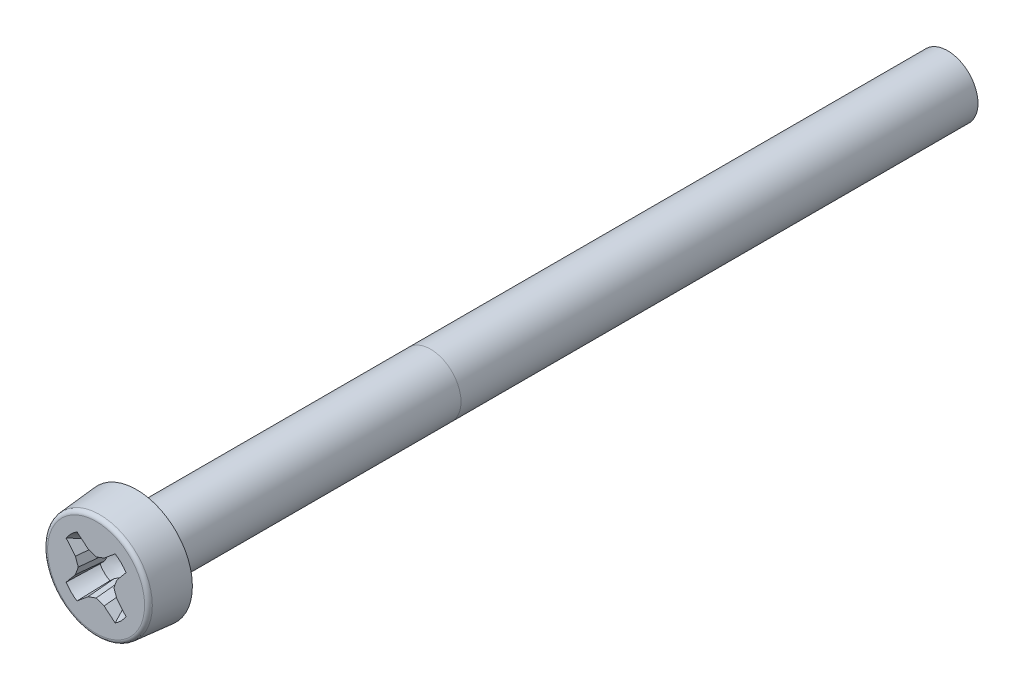
ISO-10303-21;
HEADER;
FILE_DESCRIPTION(('STEP AP214'),'2;1');
FILE_NAME('part.step','',(''),(''),'','','');
FILE_SCHEMA(('AUTOMOTIVE_DESIGN { 1 0 10303 214 1 1 1 1 }'));
ENDSEC;
DATA;
#1=APPLICATION_CONTEXT('core data for automotive mechanical design processes');
#2=APPLICATION_PROTOCOL_DEFINITION('international standard','automotive_design',2000,#1);
#3=PRODUCT_CONTEXT('',#1,'mechanical');
#4=PRODUCT('Part','Part','',(#3));
#5=PRODUCT_RELATED_PRODUCT_CATEGORY('part','',(#4));
#6=PRODUCT_DEFINITION_FORMATION('','',#4);
#7=PRODUCT_DEFINITION_CONTEXT('part definition',#1,'design');
#8=PRODUCT_DEFINITION('design','',#6,#7);
#9=PRODUCT_DEFINITION_SHAPE('','',#8);
#10=(LENGTH_UNIT() NAMED_UNIT(*) SI_UNIT(.MILLI.,.METRE.));
#11=(NAMED_UNIT(*) PLANE_ANGLE_UNIT() SI_UNIT($,.RADIAN.));
#12=(NAMED_UNIT(*) SI_UNIT($,.STERADIAN.) SOLID_ANGLE_UNIT());
#13=UNCERTAINTY_MEASURE_WITH_UNIT(LENGTH_MEASURE(1.E-05),#10,'distance_accuracy_value','');
#14=(GEOMETRIC_REPRESENTATION_CONTEXT(3) GLOBAL_UNCERTAINTY_ASSIGNED_CONTEXT((#13)) GLOBAL_UNIT_ASSIGNED_CONTEXT((#10,
#11,#12)) REPRESENTATION_CONTEXT('',''));
#15=CARTESIAN_POINT('',(0.,0.,0.));
#16=DIRECTION('',(0.,0.,1.));
#17=DIRECTION('',(1.,0.,0.));
#18=AXIS2_PLACEMENT_3D('',#15,#16,#17);
#19=CARTESIAN_POINT('',(0.,0.,-40.));
#20=DIRECTION('',(0.,0.,1.));
#21=DIRECTION('',(1.,0.,0.));
#22=AXIS2_PLACEMENT_3D('',#19,#20,#21);
#23=PLANE('',#22);
#24=CARTESIAN_POINT('',(0.,0.,-40.));
#25=DIRECTION('',(0.,0.,1.));
#26=DIRECTION('',(1.,0.,0.));
#27=AXIS2_PLACEMENT_3D('',#24,#25,#26);
#28=CIRCLE('',#27,1.5);
#29=CARTESIAN_POINT('',(1.5,0.,-40.));
#30=VERTEX_POINT('',#29);
#31=EDGE_CURVE('E11',#30,#30,#28,.T.);
#32=ORIENTED_EDGE('',*,*,#31,.F.);
#33=EDGE_LOOP('',(#32));
#34=FACE_BOUND('',#33,.T.);
#35=ADVANCED_FACE('F16',(#34),#23,.F.);
#36=CARTESIAN_POINT('',(0.,0.,-14.5));
#37=DIRECTION('',(0.,0.,-1.));
#38=DIRECTION('',(1.,0.,0.));
#39=AXIS2_PLACEMENT_3D('',#36,#37,#38);
#40=CYLINDRICAL_SURFACE('',#39,1.5);
#41=DIRECTION('',(0.,0.,-1.));
#42=VECTOR('',#41,1.);
#43=CARTESIAN_POINT('',(1.5,0.,-14.5));
#44=LINE('',#43,#42);
#45=CARTESIAN_POINT('',(1.5,0.,-14.5));
#46=VERTEX_POINT('',#45);
#47=EDGE_CURVE('E29',#46,#30,#44,.T.);
#48=ORIENTED_EDGE('',*,*,#47,.T.);
#49=ORIENTED_EDGE('',*,*,#31,.T.);
#50=ORIENTED_EDGE('',*,*,#47,.F.);
#51=CARTESIAN_POINT('',(0.,0.,-14.5));
#52=DIRECTION('',(0.,0.,1.));
#53=DIRECTION('',(1.,0.,0.));
#54=AXIS2_PLACEMENT_3D('',#51,#52,#53);
#55=CIRCLE('',#54,1.5);
#56=EDGE_CURVE('E341',#46,#46,#55,.T.);
#57=ORIENTED_EDGE('',*,*,#56,.F.);
#58=EDGE_LOOP('',(#48,#49,#50,#57));
#59=FACE_BOUND('',#58,.T.);
#60=ADVANCED_FACE('F628',(#59),#40,.T.);
#61=CARTESIAN_POINT('',(0.,0.,-0.1));
#62=DIRECTION('',(0.,0.,-1.));
#63=DIRECTION('',(1.,0.,0.));
#64=AXIS2_PLACEMENT_3D('',#61,#62,#63);
#65=CYLINDRICAL_SURFACE('',#64,1.5);
#66=DIRECTION('',(0.,0.,-1.));
#67=VECTOR('',#66,1.);
#68=CARTESIAN_POINT('',(1.5,0.,-0.1));
#69=LINE('',#68,#67);
#70=CARTESIAN_POINT('',(1.5,0.,-0.1));
#71=VERTEX_POINT('',#70);
#72=EDGE_CURVE('E334',#71,#46,#69,.T.);
#73=ORIENTED_EDGE('',*,*,#72,.T.);
#74=ORIENTED_EDGE('',*,*,#56,.T.);
#75=ORIENTED_EDGE('',*,*,#72,.F.);
#76=CARTESIAN_POINT('',(0.,0.,-0.1));
#77=DIRECTION('',(0.,0.,1.));
#78=DIRECTION('',(1.,0.,0.));
#79=AXIS2_PLACEMENT_3D('',#76,#77,#78);
#80=CIRCLE('',#79,1.5);
#81=EDGE_CURVE('E342',#71,#71,#80,.T.);
#82=ORIENTED_EDGE('',*,*,#81,.F.);
#83=EDGE_LOOP('',(#73,#74,#75,#82));
#84=FACE_BOUND('',#83,.T.);
#85=ADVANCED_FACE('F593',(#84),#65,.T.);
#86=CARTESIAN_POINT('',(1.6,0.,0.));
#87=CARTESIAN_POINT('',(1.54142135623731,0.,0.));
#88=CARTESIAN_POINT('',(1.5,0.,-0.0414213562373095));
#89=CARTESIAN_POINT('',(1.5,0.,-0.1));
#90=(BOUNDED_CURVE() B_SPLINE_CURVE(3,(#86,#87,#88,#89),.UNSPECIFIED.,.F.,
.F.) B_SPLINE_CURVE_WITH_KNOTS((4,4),(0.,1.),
.UNSPECIFIED.) CURVE() GEOMETRIC_REPRESENTATION_ITEM() RATIONAL_B_SPLINE_CURVE((1.,
0.804737854124365,0.804737854124365,1.)) REPRESENTATION_ITEM(''));
#91=CARTESIAN_POINT('',(0.,0.,0.));
#92=DIRECTION('',(0.,0.,-1.));
#93=AXIS1_PLACEMENT('',#91,#92);
#94=SURFACE_OF_REVOLUTION('',#90,#93);
#95=CARTESIAN_POINT('',(1.6,0.,-0.1));
#96=DIRECTION('',(0.,-1.,0.));
#97=DIRECTION('',(0.,0.,1.));
#98=AXIS2_PLACEMENT_3D('',#95,#96,#97);
#99=CIRCLE('',#98,0.1);
#100=CARTESIAN_POINT('',(1.6,0.,0.));
#101=VERTEX_POINT('',#100);
#102=EDGE_CURVE('E419',#101,#71,#99,.T.);
#103=ORIENTED_EDGE('',*,*,#102,.T.);
#104=ORIENTED_EDGE('',*,*,#81,.T.);
#105=ORIENTED_EDGE('',*,*,#102,.F.);
#106=CARTESIAN_POINT('',(0.,0.,0.));
#107=DIRECTION('',(0.,0.,1.));
#108=DIRECTION('',(1.,0.,0.));
#109=AXIS2_PLACEMENT_3D('',#106,#107,#108);
#110=CIRCLE('',#109,1.6);
#111=EDGE_CURVE('E510',#101,#101,#110,.T.);
#112=ORIENTED_EDGE('',*,*,#111,.F.);
#113=EDGE_LOOP('',(#103,#104,#105,#112));
#114=FACE_BOUND('',#113,.T.);
#115=ADVANCED_FACE('F589',(#114),#94,.T.);
#116=CARTESIAN_POINT('',(0.,0.,0.));
#117=DIRECTION('',(0.,0.,1.));
#118=DIRECTION('',(1.,0.,0.));
#119=AXIS2_PLACEMENT_3D('',#116,#117,#118);
#120=PLANE('',#119);
#121=ORIENTED_EDGE('',*,*,#111,.T.);
#122=EDGE_LOOP('',(#121));
#123=FACE_BOUND('',#122,.T.);
#124=CARTESIAN_POINT('',(0.,0.,0.));
#125=DIRECTION('',(0.,0.,1.));
#126=DIRECTION('',(1.,0.,0.));
#127=AXIS2_PLACEMENT_3D('',#124,#125,#126);
#128=CIRCLE('',#127,2.75);
#129=CARTESIAN_POINT('',(2.75,0.,0.));
#130=VERTEX_POINT('',#129);
#131=EDGE_CURVE('E285',#130,#130,#128,.T.);
#132=ORIENTED_EDGE('',*,*,#131,.F.);
#133=EDGE_LOOP('',(#132));
#134=FACE_BOUND('',#133,.T.);
#135=ADVANCED_FACE('F592',(#123,#134),#120,.F.);
#136=CARTESIAN_POINT('',(0.,0.,1.81743114855));
#137=DIRECTION('',(0.,0.,-1.));
#138=DIRECTION('',(1.,0.,0.));
#139=AXIS2_PLACEMENT_3D('',#136,#137,#138);
#140=CONICAL_SURFACE('',#139,2.591759345272,0.08684928479054);
#141=DIRECTION('',(0.0867401448538781,0.,-0.996230970844978));
#142=VECTOR('',#141,1.);
#143=CARTESIAN_POINT('',(2.591759345272,0.,1.81743114855));
#144=LINE('',#143,#142);
#145=CARTESIAN_POINT('',(2.591759345272,0.,1.81743114855));
#146=VERTEX_POINT('',#145);
#147=EDGE_CURVE('E281',#146,#130,#144,.T.);
#148=ORIENTED_EDGE('',*,*,#147,.T.);
#149=ORIENTED_EDGE('',*,*,#131,.T.);
#150=ORIENTED_EDGE('',*,*,#147,.F.);
#151=CARTESIAN_POINT('',(0.,0.,1.81743114855));
#152=DIRECTION('',(0.,0.,1.));
#153=DIRECTION('',(1.,0.,0.));
#154=AXIS2_PLACEMENT_3D('',#151,#152,#153);
#155=CIRCLE('',#154,2.591759345272);
#156=EDGE_CURVE('E286',#146,#146,#155,.T.);
#157=ORIENTED_EDGE('',*,*,#156,.F.);
#158=EDGE_LOOP('',(#148,#149,#150,#157));
#159=FACE_BOUND('',#158,.T.);
#160=ADVANCED_FACE('F601',(#159),#140,.T.);
#161=CARTESIAN_POINT('',(2.392520405653,0.,2.));
#162=CARTESIAN_POINT('',(2.50172635124258,0.,2.));
#163=CARTESIAN_POINT('',(2.58224141997077,0.,1.92622153254636));
#164=CARTESIAN_POINT('',(2.59175934527131,0.,1.81743114854994));
#165=(BOUNDED_CURVE() B_SPLINE_CURVE(3,(#161,#162,#163,#164),.UNSPECIFIED.,.F.,
.F.) B_SPLINE_CURVE_WITH_KNOTS((4,4),(0.,1.),
.UNSPECIFIED.) CURVE() GEOMETRIC_REPRESENTATION_ITEM() RATIONAL_B_SPLINE_CURVE((1.,
0.824851557873878,0.824851557873878,1.)) REPRESENTATION_ITEM(''));
#166=CARTESIAN_POINT('',(0.,0.,0.));
#167=DIRECTION('',(0.,0.,-1.));
#168=AXIS1_PLACEMENT('',#166,#167);
#169=SURFACE_OF_REVOLUTION('',#165,#168);
#170=CARTESIAN_POINT('',(2.392520405653,0.,1.8));
#171=DIRECTION('',(0.,1.,0.));
#172=DIRECTION('',(0.,0.,1.));
#173=AXIS2_PLACEMENT_3D('',#170,#171,#172);
#174=CIRCLE('',#173,0.2);
#175=CARTESIAN_POINT('',(2.392520405653,0.,2.));
#176=VERTEX_POINT('',#175);
#177=EDGE_CURVE('E421',#176,#146,#174,.T.);
#178=ORIENTED_EDGE('',*,*,#177,.T.);
#179=ORIENTED_EDGE('',*,*,#156,.T.);
#180=ORIENTED_EDGE('',*,*,#177,.F.);
#181=CARTESIAN_POINT('',(0.,0.,2.));
#182=DIRECTION('',(0.,0.,1.));
#183=DIRECTION('',(1.,0.,0.));
#184=AXIS2_PLACEMENT_3D('',#181,#182,#183);
#185=CIRCLE('',#184,2.392520405653);
#186=EDGE_CURVE('E400',#176,#176,#185,.T.);
#187=ORIENTED_EDGE('',*,*,#186,.F.);
#188=EDGE_LOOP('',(#178,#179,#180,#187));
#189=FACE_BOUND('',#188,.T.);
#190=ADVANCED_FACE('F18',(#189),#169,.T.);
#191=CARTESIAN_POINT('',(0.947023607927,0.1975,1.963875213625));
#192=DIRECTION('',(-0.936058801009871,0.338983327629953,0.094256165002017));
#193=DIRECTION('',(0.100188061612041,0.,0.994968518250915));
#194=AXIS2_PLACEMENT_3D('',#191,#192,#193);
#195=PLANE('',#194);
#196=CARTESIAN_POINT('',(0.734999999999596,-9.30616694816422E-13,0.56855685952255));
#197=CARTESIAN_POINT('',(0.79980153318715,0.169360524085245,0.603012445904495));
#198=CARTESIAN_POINT('',(0.890868365166978,0.394999999999386,0.695907050353568));
#199=(BOUNDED_CURVE() B_SPLINE_CURVE(2,(#196,#197,#198),.UNSPECIFIED.,.F.,
.F.) B_SPLINE_CURVE_WITH_KNOTS((3,3),(0.,1.),
.UNSPECIFIED.) CURVE() GEOMETRIC_REPRESENTATION_ITEM() RATIONAL_B_SPLINE_CURVE((1.,
1.03521369543437,1.)) REPRESENTATION_ITEM(''));
#200=CARTESIAN_POINT('',(0.735,0.,0.568556859522));
#201=VERTEX_POINT('',#200);
#202=CARTESIAN_POINT('',(0.890868365168,0.395,0.695907050353));
#203=VERTEX_POINT('',#202);
#204=EDGE_CURVE('E372',#201,#203,#199,.T.);
#205=ORIENTED_EDGE('',*,*,#204,.F.);
#206=DIRECTION('',(-0.100188061611992,0.,-0.99496851825092));
#207=VECTOR('',#206,1.);
#208=CARTESIAN_POINT('',(1.055354479088,0.,3.75));
#209=LINE('',#208,#207);
#210=CARTESIAN_POINT('',(0.879138745017,0.,2.));
#211=VERTEX_POINT('',#210);
#212=EDGE_CURVE('E414',#211,#201,#209,.T.);
#213=ORIENTED_EDGE('',*,*,#212,.F.);
#214=DIRECTION('',(0.340499237923964,0.940244792047901,0.));
#215=VECTOR('',#214,1.);
#216=CARTESIAN_POINT('',(0.863725539296,-0.04256158250679,2.));
#217=LINE('',#216,#215);
#218=CARTESIAN_POINT('',(1.022183620264,0.395,2.));
#219=VERTEX_POINT('',#218);
#220=EDGE_CURVE('E458',#211,#219,#217,.T.);
#221=ORIENTED_EDGE('',*,*,#220,.T.);
#222=DIRECTION('',(-0.100188061611992,0.,-0.99496851825092));
#223=VECTOR('',#222,1.);
#224=CARTESIAN_POINT('',(1.198399354335,0.395,3.75));
#225=LINE('',#224,#223);
#226=EDGE_CURVE('E425',#219,#203,#225,.T.);
#227=ORIENTED_EDGE('',*,*,#226,.T.);
#228=EDGE_LOOP('',(#205,#213,#221,#227));
#229=FACE_BOUND('',#228,.T.);
#230=ADVANCED_FACE('F621',(#229),#195,.T.);
#231=CARTESIAN_POINT('',(2.231021642134,1.854404484376,1.963875213625));
#232=DIRECTION('',(-0.766881371683238,0.637126278968198,0.077220893632314));
#233=DIRECTION('',(0.100188061612077,0.,0.994968518250911));
#234=AXIS2_PLACEMENT_3D('',#231,#232,#233);
#235=PLANE('',#234);
#236=ORIENTED_EDGE('',*,*,#226,.F.);
#237=DIRECTION('',(0.63903443020369,0.769178130873627,0.));
#238=VECTOR('',#237,1.);
#239=CARTESIAN_POINT('',(1.321889247435,0.755742713105,2.));
#240=LINE('',#239,#238);
#241=CARTESIAN_POINT('',(1.475615257504,0.940776068904,2.));
#242=VERTEX_POINT('',#241);
#243=EDGE_CURVE('E462',#219,#242,#240,.T.);
#244=ORIENTED_EDGE('',*,*,#243,.T.);
#245=CARTESIAN_POINT('',(1.01386992590352,0.53206463267813,0.786557726503453));
#246=CARTESIAN_POINT('',(1.19475352467598,0.692704437911324,1.25752379887743));
#247=CARTESIAN_POINT('',(1.47561525750289,0.940776068904322,2.00000000000102));
#248=(BOUNDED_CURVE() B_SPLINE_CURVE(2,(#245,#246,#247),.UNSPECIFIED.,.F.,
.F.) B_SPLINE_CURVE_WITH_KNOTS((3,3),(0.,1.),
.UNSPECIFIED.) CURVE() GEOMETRIC_REPRESENTATION_ITEM() RATIONAL_B_SPLINE_CURVE((1.,
1.02497922150491,1.)) REPRESENTATION_ITEM(''));
#249=CARTESIAN_POINT('',(1.013869925904,0.532064632678,0.786557726503));
#250=VERTEX_POINT('',#249);
#251=EDGE_CURVE('E333',#250,#242,#248,.T.);
#252=ORIENTED_EDGE('',*,*,#251,.F.);
#253=CARTESIAN_POINT('',(0.890868365167427,0.395000000000776,0.695907050352949));
#254=CARTESIAN_POINT('',(0.947308492793762,0.457964771378293,0.736911134212639));
#255=CARTESIAN_POINT('',(1.01386992590389,0.532064632678474,0.786557726502873));
#256=(BOUNDED_CURVE() B_SPLINE_CURVE(2,(#253,#254,#255),.UNSPECIFIED.,.F.,
.F.) B_SPLINE_CURVE_WITH_KNOTS((3,3),(0.,1.),
.UNSPECIFIED.) CURVE() GEOMETRIC_REPRESENTATION_ITEM() RATIONAL_B_SPLINE_CURVE((1.,
1.00391683537931,1.)) REPRESENTATION_ITEM(''));
#257=EDGE_CURVE('E245',#203,#250,#256,.T.);
#258=ORIENTED_EDGE('',*,*,#257,.F.);
#259=EDGE_LOOP('',(#236,#244,#252,#258));
#260=FACE_BOUND('',#259,.T.);
#261=ADVANCED_FACE('F624',(#260),#235,.T.);
#262=CARTESIAN_POINT('',(0.,0.,2.875));
#263=DIRECTION('',(0.,0.,1.));
#264=DIRECTION('',(1.,0.,0.));
#265=AXIS2_PLACEMENT_3D('',#262,#263,#264);
#266=CONICAL_SURFACE('',#265,2.186258907047,0.462512251778);
#267=CARTESIAN_POINT('',(0.,0.,0.786557726503));
#268=DIRECTION('',(0.,0.,1.));
#269=DIRECTION('',(1.,0.,0.));
#270=AXIS2_PLACEMENT_3D('',#267,#268,#269);
#271=CIRCLE('',#270,1.145);
#272=CARTESIAN_POINT('',(0.532064632678,1.013869925904,0.786557726503));
#273=VERTEX_POINT('',#272);
#274=EDGE_CURVE('E238',#250,#273,#271,.T.);
#275=ORIENTED_EDGE('',*,*,#274,.F.);
#276=ORIENTED_EDGE('',*,*,#251,.T.);
#277=CARTESIAN_POINT('',(0.,0.,2.));
#278=DIRECTION('',(0.,0.,-1.));
#279=DIRECTION('',(1.,0.,0.));
#280=AXIS2_PLACEMENT_3D('',#277,#278,#279);
#281=CIRCLE('',#280,1.75);
#282=CARTESIAN_POINT('',(0.940776068904,1.475615257504,2.));
#283=VERTEX_POINT('',#282);
#284=EDGE_CURVE('E442',#283,#242,#281,.T.);
#285=ORIENTED_EDGE('',*,*,#284,.F.);
#286=CARTESIAN_POINT('',(0.940776068953974,1.47561525755911,2.00000000014963));
#287=CARTESIAN_POINT('',(0.692704437933355,1.19475352470083,1.25752379894243));
#288=CARTESIAN_POINT('',(0.532064632687296,1.01386992591384,0.786557726530328));
#289=(BOUNDED_CURVE() B_SPLINE_CURVE(2,(#286,#287,#288),.UNSPECIFIED.,.F.,
.F.) B_SPLINE_CURVE_WITH_KNOTS((3,3),(0.,1.),
.UNSPECIFIED.) CURVE() GEOMETRIC_REPRESENTATION_ITEM() RATIONAL_B_SPLINE_CURVE((1.,
1.02497922150815,1.)) REPRESENTATION_ITEM(''));
#290=EDGE_CURVE('E222',#283,#273,#289,.T.);
#291=ORIENTED_EDGE('',*,*,#290,.T.);
#292=EDGE_LOOP('',(#275,#276,#285,#291));
#293=FACE_BOUND('',#292,.T.);
#294=ADVANCED_FACE('F665',(#293),#266,.F.);
#295=CARTESIAN_POINT('',(1.854404484376,2.231021642134,1.963875213625));
#296=DIRECTION('',(0.637126278968198,-0.766881371683238,0.077220893632314));
#297=DIRECTION('',(0.,-0.100188061612077,-0.994968518250911));
#298=AXIS2_PLACEMENT_3D('',#295,#296,#297);
#299=PLANE('',#298);
#300=DIRECTION('',(-0.769178130873627,-0.63903443020369,0.));
#301=VECTOR('',#300,1.);
#302=CARTESIAN_POINT('',(0.755742713105,1.321889247435,2.));
#303=LINE('',#302,#301);
#304=CARTESIAN_POINT('',(0.395,1.022183620264,2.));
#305=VERTEX_POINT('',#304);
#306=EDGE_CURVE('E217',#283,#305,#303,.T.);
#307=ORIENTED_EDGE('',*,*,#306,.T.);
#308=DIRECTION('',(0.,-0.100188061611992,-0.99496851825092));
#309=VECTOR('',#308,1.);
#310=CARTESIAN_POINT('',(0.395,1.198399354335,3.75));
#311=LINE('',#310,#309);
#312=CARTESIAN_POINT('',(0.395,0.890868365168,0.695907050353));
#313=VERTEX_POINT('',#312);
#314=EDGE_CURVE('E210',#305,#313,#311,.T.);
#315=ORIENTED_EDGE('',*,*,#314,.T.);
#316=CARTESIAN_POINT('',(0.532064632671514,1.01386992589764,0.78655772649821));
#317=CARTESIAN_POINT('',(0.457964771373067,0.947308492789073,0.736911134209192));
#318=CARTESIAN_POINT('',(0.394999999996869,0.890868365163925,0.695907050350404));
#319=(BOUNDED_CURVE() B_SPLINE_CURVE(2,(#316,#317,#318),.UNSPECIFIED.,.F.,
.F.) B_SPLINE_CURVE_WITH_KNOTS((3,3),(0.,1.),
.UNSPECIFIED.) CURVE() GEOMETRIC_REPRESENTATION_ITEM() RATIONAL_B_SPLINE_CURVE((1.,
1.00391683537685,1.)) REPRESENTATION_ITEM(''));
#320=EDGE_CURVE('E214',#273,#313,#319,.T.);
#321=ORIENTED_EDGE('',*,*,#320,.F.);
#322=ORIENTED_EDGE('',*,*,#290,.F.);
#323=EDGE_LOOP('',(#307,#315,#321,#322));
#324=FACE_BOUND('',#323,.T.);
#325=ADVANCED_FACE('F212',(#324),#299,.T.);
#326=CARTESIAN_POINT('',(0.1975,0.947023607927,1.963875213625));
#327=DIRECTION('',(0.338983327629953,-0.936058801009871,0.094256165002017));
#328=DIRECTION('',(0.,-0.100188061612041,-0.994968518250915));
#329=AXIS2_PLACEMENT_3D('',#326,#327,#328);
#330=PLANE('',#329);
#331=ORIENTED_EDGE('',*,*,#314,.F.);
#332=DIRECTION('',(-0.940244792047901,-0.340499237923964,0.));
#333=VECTOR('',#332,1.);
#334=CARTESIAN_POINT('',(-0.04256158250679,0.863725539296,2.));
#335=LINE('',#334,#333);
#336=CARTESIAN_POINT('',(0.,0.879138745017,2.));
#337=VERTEX_POINT('',#336);
#338=EDGE_CURVE('E343',#305,#337,#335,.T.);
#339=ORIENTED_EDGE('',*,*,#338,.T.);
#340=DIRECTION('',(0.,-0.100188061611992,-0.99496851825092));
#341=VECTOR('',#340,1.);
#342=CARTESIAN_POINT('',(0.,1.055354479088,3.75));
#343=LINE('',#342,#341);
#344=CARTESIAN_POINT('',(0.,0.735,0.568556859522));
#345=VERTEX_POINT('',#344);
#346=EDGE_CURVE('E223',#337,#345,#343,.T.);
#347=ORIENTED_EDGE('',*,*,#346,.T.);
#348=CARTESIAN_POINT('',(0.395000000005466,0.890868365169431,0.695907050356071));
#349=CARTESIAN_POINT('',(0.169360524089203,0.799801533188704,0.603012445905683));
#350=CARTESIAN_POINT('',(2.0108636977767E-12,0.735000000000722,0.568556859523148));
#351=(BOUNDED_CURVE() B_SPLINE_CURVE(2,(#348,#349,#350),.UNSPECIFIED.,.F.,
.F.) B_SPLINE_CURVE_WITH_KNOTS((3,3),(0.,1.),
.UNSPECIFIED.) CURVE() GEOMETRIC_REPRESENTATION_ITEM() RATIONAL_B_SPLINE_CURVE((1.,
1.03521369543474,1.)) REPRESENTATION_ITEM(''));
#352=EDGE_CURVE('E226',#313,#345,#351,.T.);
#353=ORIENTED_EDGE('',*,*,#352,.F.);
#354=EDGE_LOOP('',(#331,#339,#347,#353));
#355=FACE_BOUND('',#354,.T.);
#356=ADVANCED_FACE('F227',(#355),#330,.T.);
#357=CARTESIAN_POINT('',(-0.1975,0.947023607927,1.963875213625));
#358=DIRECTION('',(-0.338983327629953,-0.936058801009871,0.094256165002017));
#359=DIRECTION('',(-0.940244792048157,0.340499237923256,0.));
#360=AXIS2_PLACEMENT_3D('',#357,#358,#359);
#361=PLANE('',#360);
#362=CARTESIAN_POINT('',(9.30616694816422E-13,0.734999999999596,0.56855685952255));
#363=CARTESIAN_POINT('',(-0.169360524085245,0.79980153318715,0.603012445904495));
#364=CARTESIAN_POINT('',(-0.394999999999386,0.890868365166978,0.695907050353568));
#365=(BOUNDED_CURVE() B_SPLINE_CURVE(2,(#362,#363,#364),.UNSPECIFIED.,.F.,
.F.) B_SPLINE_CURVE_WITH_KNOTS((3,3),(0.,1.),
.UNSPECIFIED.) CURVE() GEOMETRIC_REPRESENTATION_ITEM() RATIONAL_B_SPLINE_CURVE((1.,
1.03521369543437,1.)) REPRESENTATION_ITEM(''));
#366=CARTESIAN_POINT('',(-0.395,0.890868365168,0.695907050353));
#367=VERTEX_POINT('',#366);
#368=EDGE_CURVE('E232',#345,#367,#365,.T.);
#369=ORIENTED_EDGE('',*,*,#368,.F.);
#370=ORIENTED_EDGE('',*,*,#346,.F.);
#371=DIRECTION('',(-0.940244792047901,0.340499237923964,0.));
#372=VECTOR('',#371,1.);
#373=CARTESIAN_POINT('',(0.04256158250679,0.863725539296,2.));
#374=LINE('',#373,#372);
#375=CARTESIAN_POINT('',(-0.395,1.022183620264,2.));
#376=VERTEX_POINT('',#375);
#377=EDGE_CURVE('E346',#337,#376,#374,.T.);
#378=ORIENTED_EDGE('',*,*,#377,.T.);
#379=DIRECTION('',(0.,-0.100188061611992,-0.99496851825092));
#380=VECTOR('',#379,1.);
#381=CARTESIAN_POINT('',(-0.395,1.198399354335,3.75));
#382=LINE('',#381,#380);
#383=EDGE_CURVE('E457',#376,#367,#382,.T.);
#384=ORIENTED_EDGE('',*,*,#383,.T.);
#385=EDGE_LOOP('',(#369,#370,#378,#384));
#386=FACE_BOUND('',#385,.T.);
#387=ADVANCED_FACE('F599',(#386),#361,.T.);
#388=CARTESIAN_POINT('',(-1.854404484376,2.231021642134,1.963875213625));
#389=DIRECTION('',(-0.637126278968198,-0.766881371683238,0.077220893632314));
#390=DIRECTION('',(-0.769178130873751,0.639034430203539,0.));
#391=AXIS2_PLACEMENT_3D('',#388,#389,#390);
#392=PLANE('',#391);
#393=ORIENTED_EDGE('',*,*,#383,.F.);
#394=DIRECTION('',(-0.769178130873627,0.63903443020369,0.));
#395=VECTOR('',#394,1.);
#396=CARTESIAN_POINT('',(-0.755742713105,1.321889247435,2.));
#397=LINE('',#396,#395);
#398=CARTESIAN_POINT('',(-0.940776068904,1.475615257504,2.));
#399=VERTEX_POINT('',#398);
#400=EDGE_CURVE('E538',#376,#399,#397,.T.);
#401=ORIENTED_EDGE('',*,*,#400,.T.);
#402=CARTESIAN_POINT('',(-0.53206463267813,1.01386992590352,0.786557726503453));
#403=CARTESIAN_POINT('',(-0.692704437911324,1.19475352467598,1.25752379887743));
#404=CARTESIAN_POINT('',(-0.940776068904322,1.47561525750289,2.00000000000102));
#405=(BOUNDED_CURVE() B_SPLINE_CURVE(2,(#402,#403,#404),.UNSPECIFIED.,.F.,
.F.) B_SPLINE_CURVE_WITH_KNOTS((3,3),(0.,1.),
.UNSPECIFIED.) CURVE() GEOMETRIC_REPRESENTATION_ITEM() RATIONAL_B_SPLINE_CURVE((1.,
1.02497922150491,1.)) REPRESENTATION_ITEM(''));
#406=CARTESIAN_POINT('',(-0.532064632678,1.013869925904,0.786557726503));
#407=VERTEX_POINT('',#406);
#408=EDGE_CURVE('E291',#407,#399,#405,.T.);
#409=ORIENTED_EDGE('',*,*,#408,.F.);
#410=CARTESIAN_POINT('',(-0.395000000000776,0.890868365167427,0.695907050352949));
#411=CARTESIAN_POINT('',(-0.457964771378293,0.947308492793763,0.736911134212639));
#412=CARTESIAN_POINT('',(-0.532064632678474,1.01386992590389,0.786557726502873));
#413=(BOUNDED_CURVE() B_SPLINE_CURVE(2,(#410,#411,#412),.UNSPECIFIED.,.F.,
.F.) B_SPLINE_CURVE_WITH_KNOTS((3,3),(0.,1.),
.UNSPECIFIED.) CURVE() GEOMETRIC_REPRESENTATION_ITEM() RATIONAL_B_SPLINE_CURVE((1.,
1.00391683537894,1.)) REPRESENTATION_ITEM(''));
#414=EDGE_CURVE('E306',#367,#407,#413,.T.);
#415=ORIENTED_EDGE('',*,*,#414,.F.);
#416=EDGE_LOOP('',(#393,#401,#409,#415));
#417=FACE_BOUND('',#416,.T.);
#418=ADVANCED_FACE('F595',(#417),#392,.T.);
#419=CARTESIAN_POINT('',(0.,0.,2.875));
#420=DIRECTION('',(0.,0.,1.));
#421=DIRECTION('',(1.,0.,0.));
#422=AXIS2_PLACEMENT_3D('',#419,#420,#421);
#423=CONICAL_SURFACE('',#422,2.186258907047,0.462512251778);
#424=CARTESIAN_POINT('',(0.,0.,0.786557726503));
#425=DIRECTION('',(0.,0.,1.));
#426=DIRECTION('',(1.,0.,0.));
#427=AXIS2_PLACEMENT_3D('',#424,#425,#426);
#428=CIRCLE('',#427,1.145);
#429=CARTESIAN_POINT('',(-1.013869925904,0.532064632678,0.786557726503));
#430=VERTEX_POINT('',#429);
#431=EDGE_CURVE('E378',#407,#430,#428,.T.);
#432=ORIENTED_EDGE('',*,*,#431,.F.);
#433=ORIENTED_EDGE('',*,*,#408,.T.);
#434=CARTESIAN_POINT('',(0.,0.,2.));
#435=DIRECTION('',(0.,0.,-1.));
#436=DIRECTION('',(1.,0.,0.));
#437=AXIS2_PLACEMENT_3D('',#434,#435,#436);
#438=CIRCLE('',#437,1.75);
#439=CARTESIAN_POINT('',(-1.475615257504,0.940776068904,2.));
#440=VERTEX_POINT('',#439);
#441=EDGE_CURVE('E542',#440,#399,#438,.T.);
#442=ORIENTED_EDGE('',*,*,#441,.F.);
#443=CARTESIAN_POINT('',(-1.47561525755911,0.940776068953974,2.00000000014963));
#444=CARTESIAN_POINT('',(-1.19475352470083,0.692704437933355,1.25752379894243));
#445=CARTESIAN_POINT('',(-1.01386992591384,0.532064632687296,0.786557726530328));
#446=(BOUNDED_CURVE() B_SPLINE_CURVE(2,(#443,#444,#445),.UNSPECIFIED.,.F.,
.F.) B_SPLINE_CURVE_WITH_KNOTS((3,3),(0.,1.),
.UNSPECIFIED.) CURVE() GEOMETRIC_REPRESENTATION_ITEM() RATIONAL_B_SPLINE_CURVE((1.,
1.02497922150815,1.)) REPRESENTATION_ITEM(''));
#447=EDGE_CURVE('E287',#440,#430,#446,.T.);
#448=ORIENTED_EDGE('',*,*,#447,.T.);
#449=EDGE_LOOP('',(#432,#433,#442,#448));
#450=FACE_BOUND('',#449,.T.);
#451=ADVANCED_FACE('F598',(#450),#423,.F.);
#452=CARTESIAN_POINT('',(-2.231021642134,1.854404484376,1.963875213625));
#453=DIRECTION('',(0.766881371683238,0.637126278968198,0.077220893632314));
#454=DIRECTION('',(0.,0.12032133382455,-0.992734998187674));
#455=AXIS2_PLACEMENT_3D('',#452,#453,#454);
#456=PLANE('',#455);
#457=DIRECTION('',(0.63903443020369,-0.769178130873627,0.));
#458=VECTOR('',#457,1.);
#459=CARTESIAN_POINT('',(-1.321889247435,0.755742713105,2.));
#460=LINE('',#459,#458);
#461=CARTESIAN_POINT('',(-1.022183620264,0.395,2.));
#462=VERTEX_POINT('',#461);
#463=EDGE_CURVE('E537',#440,#462,#460,.T.);
#464=ORIENTED_EDGE('',*,*,#463,.T.);
#465=DIRECTION('',(0.100188061611992,0.,-0.99496851825092));
#466=VECTOR('',#465,1.);
#467=CARTESIAN_POINT('',(-1.198399354335,0.395,3.75));
#468=LINE('',#467,#466);
#469=CARTESIAN_POINT('',(-0.890868365168,0.395,0.695907050353));
#470=VERTEX_POINT('',#469);
#471=EDGE_CURVE('E292',#462,#470,#468,.T.);
#472=ORIENTED_EDGE('',*,*,#471,.T.);
#473=CARTESIAN_POINT('',(-1.01386992589764,0.532064632671514,0.78655772649821));
#474=CARTESIAN_POINT('',(-0.947308492789072,0.457964771373067,0.736911134209191));
#475=CARTESIAN_POINT('',(-0.890868365163925,0.394999999996869,0.695907050350404));
#476=(BOUNDED_CURVE() B_SPLINE_CURVE(2,(#473,#474,#475),.UNSPECIFIED.,.F.,
.F.) B_SPLINE_CURVE_WITH_KNOTS((3,3),(0.,1.),
.UNSPECIFIED.) CURVE() GEOMETRIC_REPRESENTATION_ITEM() RATIONAL_B_SPLINE_CURVE((1.,
1.00391683537771,1.)) REPRESENTATION_ITEM(''));
#477=EDGE_CURVE('E317',#430,#470,#476,.T.);
#478=ORIENTED_EDGE('',*,*,#477,.F.);
#479=ORIENTED_EDGE('',*,*,#447,.F.);
#480=EDGE_LOOP('',(#464,#472,#478,#479));
#481=FACE_BOUND('',#480,.T.);
#482=ADVANCED_FACE('F656',(#481),#456,.T.);
#483=CARTESIAN_POINT('',(-0.947023607927,0.1975,1.963875213625));
#484=DIRECTION('',(0.936058801009871,0.338983327629953,0.0942561650020169));
#485=DIRECTION('',(0.,0.267892223044291,-0.963448886465902));
#486=AXIS2_PLACEMENT_3D('',#483,#484,#485);
#487=PLANE('',#486);
#488=ORIENTED_EDGE('',*,*,#471,.F.);
#489=DIRECTION('',(0.340499237923964,-0.940244792047901,0.));
#490=VECTOR('',#489,1.);
#491=CARTESIAN_POINT('',(-0.863725539296,-0.04256158250679,2.));
#492=LINE('',#491,#490);
#493=CARTESIAN_POINT('',(-0.879138745017,0.,2.));
#494=VERTEX_POINT('',#493);
#495=EDGE_CURVE('E520',#462,#494,#492,.T.);
#496=ORIENTED_EDGE('',*,*,#495,.T.);
#497=DIRECTION('',(0.100188061611992,0.,-0.99496851825092));
#498=VECTOR('',#497,1.);
#499=CARTESIAN_POINT('',(-1.055354479088,0.,3.75));
#500=LINE('',#499,#498);
#501=CARTESIAN_POINT('',(-0.735,0.,0.568556859522));
#502=VERTEX_POINT('',#501);
#503=EDGE_CURVE('E393',#494,#502,#500,.T.);
#504=ORIENTED_EDGE('',*,*,#503,.T.);
#505=CARTESIAN_POINT('',(-0.890868365169431,0.395000000005466,0.695907050356071));
#506=CARTESIAN_POINT('',(-0.799801533188704,0.169360524089203,0.603012445905683));
#507=CARTESIAN_POINT('',(-0.735000000000722,2.0108636977767E-12,0.568556859523148));
#508=(BOUNDED_CURVE() B_SPLINE_CURVE(2,(#505,#506,#507),.UNSPECIFIED.,.F.,
.F.) B_SPLINE_CURVE_WITH_KNOTS((3,3),(0.,1.),
.UNSPECIFIED.) CURVE() GEOMETRIC_REPRESENTATION_ITEM() RATIONAL_B_SPLINE_CURVE((1.,
1.03521369543473,1.)) REPRESENTATION_ITEM(''));
#509=EDGE_CURVE('E307',#470,#502,#508,.T.);
#510=ORIENTED_EDGE('',*,*,#509,.F.);
#511=EDGE_LOOP('',(#488,#496,#504,#510));
#512=FACE_BOUND('',#511,.T.);
#513=ADVANCED_FACE('F648',(#512),#487,.T.);
#514=CARTESIAN_POINT('',(-0.947023607927,-0.1975,1.963875213625));
#515=DIRECTION('',(0.936058801009871,-0.338983327629953,0.0942561650020169));
#516=DIRECTION('',(0.,-0.267892223044291,-0.963448886465902));
#517=AXIS2_PLACEMENT_3D('',#514,#515,#516);
#518=PLANE('',#517);
#519=CARTESIAN_POINT('',(-0.734999999999596,9.30616694816422E-13,0.56855685952255));
#520=CARTESIAN_POINT('',(-0.79980153318715,-0.169360524085245,0.603012445904495));
#521=CARTESIAN_POINT('',(-0.890868365166978,-0.394999999999386,0.695907050353568));
#522=(BOUNDED_CURVE() B_SPLINE_CURVE(2,(#519,#520,#521),.UNSPECIFIED.,.F.,
.F.) B_SPLINE_CURVE_WITH_KNOTS((3,3),(0.,1.),
.UNSPECIFIED.) CURVE() GEOMETRIC_REPRESENTATION_ITEM() RATIONAL_B_SPLINE_CURVE((1.,
1.03521369543437,1.)) REPRESENTATION_ITEM(''));
#523=CARTESIAN_POINT('',(-0.890868365168,-0.395,0.695907050353));
#524=VERTEX_POINT('',#523);
#525=EDGE_CURVE('E316',#502,#524,#522,.T.);
#526=ORIENTED_EDGE('',*,*,#525,.F.);
#527=ORIENTED_EDGE('',*,*,#503,.F.);
#528=DIRECTION('',(-0.340499237923964,-0.940244792047901,0.));
#529=VECTOR('',#528,1.);
#530=CARTESIAN_POINT('',(-0.863725539296,0.04256158250679,2.));
#531=LINE('',#530,#529);
#532=CARTESIAN_POINT('',(-1.022183620264,-0.395,2.));
#533=VERTEX_POINT('',#532);
#534=EDGE_CURVE('E399',#494,#533,#531,.T.);
#535=ORIENTED_EDGE('',*,*,#534,.T.);
#536=DIRECTION('',(0.100188061611992,0.,-0.99496851825092));
#537=VECTOR('',#536,1.);
#538=CARTESIAN_POINT('',(-1.198399354335,-0.395,3.75));
#539=LINE('',#538,#537);
#540=EDGE_CURVE('E386',#533,#524,#539,.T.);
#541=ORIENTED_EDGE('',*,*,#540,.T.);
#542=EDGE_LOOP('',(#526,#527,#535,#541));
#543=FACE_BOUND('',#542,.T.);
#544=ADVANCED_FACE('F644',(#543),#518,.T.);
#545=CARTESIAN_POINT('',(-2.231021642134,-1.854404484376,1.963875213625));
#546=DIRECTION('',(0.766881371683238,-0.637126278968198,0.077220893632314));
#547=DIRECTION('',(0.,-0.12032133382455,-0.992734998187674));
#548=AXIS2_PLACEMENT_3D('',#545,#546,#547);
#549=PLANE('',#548);
#550=ORIENTED_EDGE('',*,*,#540,.F.);
#551=DIRECTION('',(-0.63903443020369,-0.769178130873627,0.));
#552=VECTOR('',#551,1.);
#553=CARTESIAN_POINT('',(-1.321889247435,-0.755742713105,2.));
#554=LINE('',#553,#552);
#555=CARTESIAN_POINT('',(-1.475615257504,-0.940776068904,2.));
#556=VERTEX_POINT('',#555);
#557=EDGE_CURVE('E262',#533,#556,#554,.T.);
#558=ORIENTED_EDGE('',*,*,#557,.T.);
#559=CARTESIAN_POINT('',(-1.01386992590352,-0.53206463267813,0.786557726503453));
#560=CARTESIAN_POINT('',(-1.19475352467598,-0.692704437911324,1.25752379887743));
#561=CARTESIAN_POINT('',(-1.47561525750289,-0.940776068904322,2.00000000000102));
#562=(BOUNDED_CURVE() B_SPLINE_CURVE(2,(#559,#560,#561),.UNSPECIFIED.,.F.,
.F.) B_SPLINE_CURVE_WITH_KNOTS((3,3),(0.,1.),
.UNSPECIFIED.) CURVE() GEOMETRIC_REPRESENTATION_ITEM() RATIONAL_B_SPLINE_CURVE((1.,
1.02497922150491,1.)) REPRESENTATION_ITEM(''));
#563=CARTESIAN_POINT('',(-1.013869925904,-0.532064632678,0.786557726503));
#564=VERTEX_POINT('',#563);
#565=EDGE_CURVE('E251',#564,#556,#562,.T.);
#566=ORIENTED_EDGE('',*,*,#565,.F.);
#567=CARTESIAN_POINT('',(-0.890868365167427,-0.395000000000776,0.695907050352949));
#568=CARTESIAN_POINT('',(-0.947308492793762,-0.457964771378293,0.736911134212639));
#569=CARTESIAN_POINT('',(-1.01386992590389,-0.532064632678474,0.786557726502873));
#570=(BOUNDED_CURVE() B_SPLINE_CURVE(2,(#567,#568,#569),.UNSPECIFIED.,.F.,
.F.) B_SPLINE_CURVE_WITH_KNOTS((3,3),(0.,1.),
.UNSPECIFIED.) CURVE() GEOMETRIC_REPRESENTATION_ITEM() RATIONAL_B_SPLINE_CURVE((1.,
1.00391683537931,1.)) REPRESENTATION_ITEM(''));
#571=EDGE_CURVE('E479',#524,#564,#570,.T.);
#572=ORIENTED_EDGE('',*,*,#571,.F.);
#573=EDGE_LOOP('',(#550,#558,#566,#572));
#574=FACE_BOUND('',#573,.T.);
#575=ADVANCED_FACE('F647',(#574),#549,.T.);
#576=CARTESIAN_POINT('',(0.,0.,2.875));
#577=DIRECTION('',(0.,0.,1.));
#578=DIRECTION('',(1.,0.,0.));
#579=AXIS2_PLACEMENT_3D('',#576,#577,#578);
#580=CONICAL_SURFACE('',#579,2.186258907047,0.462512251778);
#581=CARTESIAN_POINT('',(0.,0.,0.786557726503));
#582=DIRECTION('',(0.,0.,1.));
#583=DIRECTION('',(1.,0.,0.));
#584=AXIS2_PLACEMENT_3D('',#581,#582,#583);
#585=CIRCLE('',#584,1.145);
#586=CARTESIAN_POINT('',(-0.532064632678,-1.013869925904,0.786557726503));
#587=VERTEX_POINT('',#586);
#588=EDGE_CURVE('E276',#564,#587,#585,.T.);
#589=ORIENTED_EDGE('',*,*,#588,.F.);
#590=ORIENTED_EDGE('',*,*,#565,.T.);
#591=CARTESIAN_POINT('',(0.,0.,2.));
#592=DIRECTION('',(0.,0.,-1.));
#593=DIRECTION('',(1.,0.,0.));
#594=AXIS2_PLACEMENT_3D('',#591,#592,#593);
#595=CIRCLE('',#594,1.75);
#596=CARTESIAN_POINT('',(-0.940776068904,-1.475615257504,2.));
#597=VERTEX_POINT('',#596);
#598=EDGE_CURVE('E255',#597,#556,#595,.T.);
#599=ORIENTED_EDGE('',*,*,#598,.F.);
#600=CARTESIAN_POINT('',(-0.940776068953974,-1.47561525755911,2.00000000014963));
#601=CARTESIAN_POINT('',(-0.692704437933355,-1.19475352470083,1.25752379894243));
#602=CARTESIAN_POINT('',(-0.532064632687296,-1.01386992591384,0.786557726530328));
#603=(BOUNDED_CURVE() B_SPLINE_CURVE(2,(#600,#601,#602),.UNSPECIFIED.,.F.,
.F.) B_SPLINE_CURVE_WITH_KNOTS((3,3),(0.,1.),
.UNSPECIFIED.) CURVE() GEOMETRIC_REPRESENTATION_ITEM() RATIONAL_B_SPLINE_CURVE((1.,
1.02497922150815,1.)) REPRESENTATION_ITEM(''));
#604=EDGE_CURVE('E318',#597,#587,#603,.T.);
#605=ORIENTED_EDGE('',*,*,#604,.T.);
#606=EDGE_LOOP('',(#589,#590,#599,#605));
#607=FACE_BOUND('',#606,.T.);
#608=ADVANCED_FACE('F639',(#607),#580,.F.);
#609=CARTESIAN_POINT('',(-1.854404484376,-2.231021642134,1.963875213625));
#610=DIRECTION('',(-0.637126278968198,0.766881371683238,0.077220893632314));
#611=DIRECTION('',(0.12032133382455,0.,0.992734998187674));
#612=AXIS2_PLACEMENT_3D('',#609,#610,#611);
#613=PLANE('',#612);
#614=DIRECTION('',(0.769178130873627,0.63903443020369,0.));
#615=VECTOR('',#614,1.);
#616=CARTESIAN_POINT('',(-0.755742713105,-1.321889247435,2.));
#617=LINE('',#616,#615);
#618=CARTESIAN_POINT('',(-0.395,-1.022183620264,2.));
#619=VERTEX_POINT('',#618);
#620=EDGE_CURVE('E263',#597,#619,#617,.T.);
#621=ORIENTED_EDGE('',*,*,#620,.T.);
#622=DIRECTION('',(0.,0.100188061611992,-0.99496851825092));
#623=VECTOR('',#622,1.);
#624=CARTESIAN_POINT('',(-0.395,-1.198399354335,3.75));
#625=LINE('',#624,#623);
#626=CARTESIAN_POINT('',(-0.395,-0.890868365168,0.695907050353));
#627=VERTEX_POINT('',#626);
#628=EDGE_CURVE('E359',#619,#627,#625,.T.);
#629=ORIENTED_EDGE('',*,*,#628,.T.);
#630=CARTESIAN_POINT('',(-0.532064632671514,-1.01386992589764,0.78655772649821));
#631=CARTESIAN_POINT('',(-0.457964771373067,-0.947308492789073,0.736911134209192));
#632=CARTESIAN_POINT('',(-0.394999999996869,-0.890868365163925,0.695907050350404));
#633=(BOUNDED_CURVE() B_SPLINE_CURVE(2,(#630,#631,#632),.UNSPECIFIED.,.F.,
.F.) B_SPLINE_CURVE_WITH_KNOTS((3,3),(0.,1.),
.UNSPECIFIED.) CURVE() GEOMETRIC_REPRESENTATION_ITEM() RATIONAL_B_SPLINE_CURVE((1.,
1.00391683537685,1.)) REPRESENTATION_ITEM(''));
#634=EDGE_CURVE('E270',#587,#627,#633,.T.);
#635=ORIENTED_EDGE('',*,*,#634,.F.);
#636=ORIENTED_EDGE('',*,*,#604,.F.);
#637=EDGE_LOOP('',(#621,#629,#635,#636));
#638=FACE_BOUND('',#637,.T.);
#639=ADVANCED_FACE('F636',(#638),#613,.T.);
#640=CARTESIAN_POINT('',(0.,0.,2.875));
#641=DIRECTION('',(0.,0.,1.));
#642=DIRECTION('',(1.,0.,0.));
#643=AXIS2_PLACEMENT_3D('',#640,#641,#642);
#644=CONICAL_SURFACE('',#643,2.186258907047,0.462512251778);
#645=CARTESIAN_POINT('',(0.,0.,0.786557726503));
#646=DIRECTION('',(0.,0.,1.));
#647=DIRECTION('',(1.,0.,0.));
#648=AXIS2_PLACEMENT_3D('',#645,#646,#647);
#649=CIRCLE('',#648,1.145);
#650=CARTESIAN_POINT('',(0.532064632678,-1.013869925904,0.786557726503));
#651=VERTEX_POINT('',#650);
#652=CARTESIAN_POINT('',(1.013869925904,-0.532064632678,0.786557726503));
#653=VERTEX_POINT('',#652);
#654=EDGE_CURVE('E451',#651,#653,#649,.T.);
#655=ORIENTED_EDGE('',*,*,#654,.F.);
#656=CARTESIAN_POINT('',(0.53206463267813,-1.01386992590352,0.786557726503453));
#657=CARTESIAN_POINT('',(0.692704437911324,-1.19475352467598,1.25752379887743));
#658=CARTESIAN_POINT('',(0.940776068904322,-1.47561525750289,2.00000000000102));
#659=(BOUNDED_CURVE() B_SPLINE_CURVE(2,(#656,#657,#658),.UNSPECIFIED.,.F.,
.F.) B_SPLINE_CURVE_WITH_KNOTS((3,3),(0.,1.),
.UNSPECIFIED.) CURVE() GEOMETRIC_REPRESENTATION_ITEM() RATIONAL_B_SPLINE_CURVE((1.,
1.02497922150491,1.)) REPRESENTATION_ITEM(''));
#660=CARTESIAN_POINT('',(0.940776068904,-1.475615257504,2.));
#661=VERTEX_POINT('',#660);
#662=EDGE_CURVE('E91',#651,#661,#659,.T.);
#663=ORIENTED_EDGE('',*,*,#662,.T.);
#664=CARTESIAN_POINT('',(0.,0.,2.));
#665=DIRECTION('',(0.,0.,-1.));
#666=DIRECTION('',(1.,0.,0.));
#667=AXIS2_PLACEMENT_3D('',#664,#665,#666);
#668=CIRCLE('',#667,1.75);
#669=CARTESIAN_POINT('',(1.475615257504,-0.940776068904,2.));
#670=VERTEX_POINT('',#669);
#671=EDGE_CURVE('E367',#670,#661,#668,.T.);
#672=ORIENTED_EDGE('',*,*,#671,.F.);
#673=CARTESIAN_POINT('',(1.47561525755911,-0.940776068953974,2.00000000014963));
#674=CARTESIAN_POINT('',(1.19475352470083,-0.692704437933355,1.25752379894243));
#675=CARTESIAN_POINT('',(1.01386992591384,-0.532064632687296,0.786557726530328));
#676=(BOUNDED_CURVE() B_SPLINE_CURVE(2,(#673,#674,#675),.UNSPECIFIED.,.F.,
.F.) B_SPLINE_CURVE_WITH_KNOTS((3,3),(0.,1.),
.UNSPECIFIED.) CURVE() GEOMETRIC_REPRESENTATION_ITEM() RATIONAL_B_SPLINE_CURVE((1.,
1.02497922150815,1.)) REPRESENTATION_ITEM(''));
#677=EDGE_CURVE('E107',#670,#653,#676,.T.);
#678=ORIENTED_EDGE('',*,*,#677,.T.);
#679=EDGE_LOOP('',(#655,#663,#672,#678));
#680=FACE_BOUND('',#679,.T.);
#681=ADVANCED_FACE('F616',(#680),#644,.F.);
#682=CARTESIAN_POINT('',(2.231021642134,-1.854404484376,1.963875213625));
#683=DIRECTION('',(-0.766881371683238,-0.637126278968198,0.077220893632314));
#684=DIRECTION('',(-0.639034430203539,0.769178130873751,0.));
#685=AXIS2_PLACEMENT_3D('',#682,#683,#684);
#686=PLANE('',#685);
#687=DIRECTION('',(-0.63903443020369,0.769178130873627,0.));
#688=VECTOR('',#687,1.);
#689=CARTESIAN_POINT('',(1.321889247435,-0.755742713105,2.));
#690=LINE('',#689,#688);
#691=CARTESIAN_POINT('',(1.022183620264,-0.395,2.));
#692=VERTEX_POINT('',#691);
#693=EDGE_CURVE('E361',#670,#692,#690,.T.);
#694=ORIENTED_EDGE('',*,*,#693,.T.);
#695=DIRECTION('',(-0.100188061611992,0.,-0.99496851825092));
#696=VECTOR('',#695,1.);
#697=CARTESIAN_POINT('',(1.198399354335,-0.395,3.75));
#698=LINE('',#697,#696);
#699=CARTESIAN_POINT('',(0.890868365168,-0.395,0.695907050353));
#700=VERTEX_POINT('',#699);
#701=EDGE_CURVE('E408',#692,#700,#698,.T.);
#702=ORIENTED_EDGE('',*,*,#701,.T.);
#703=CARTESIAN_POINT('',(1.01386992589764,-0.532064632671514,0.78655772649821));
#704=CARTESIAN_POINT('',(0.947308492789072,-0.457964771373067,0.736911134209191));
#705=CARTESIAN_POINT('',(0.890868365163925,-0.394999999996869,0.695907050350404));
#706=(BOUNDED_CURVE() B_SPLINE_CURVE(2,(#703,#704,#705),.UNSPECIFIED.,.F.,
.F.) B_SPLINE_CURVE_WITH_KNOTS((3,3),(0.,1.),
.UNSPECIFIED.) CURVE() GEOMETRIC_REPRESENTATION_ITEM() RATIONAL_B_SPLINE_CURVE((1.,
1.00391683537771,1.)) REPRESENTATION_ITEM(''));
#707=EDGE_CURVE('E360',#653,#700,#706,.T.);
#708=ORIENTED_EDGE('',*,*,#707,.F.);
#709=ORIENTED_EDGE('',*,*,#677,.F.);
#710=EDGE_LOOP('',(#694,#702,#708,#709));
#711=FACE_BOUND('',#710,.T.);
#712=ADVANCED_FACE('F612',(#711),#686,.T.);
#713=CARTESIAN_POINT('',(0.947023607927,-0.1975,1.963875213625));
#714=DIRECTION('',(-0.936058801009871,-0.338983327629953,0.094256165002017));
#715=DIRECTION('',(-0.340499237923256,0.940244792048157,0.));
#716=AXIS2_PLACEMENT_3D('',#713,#714,#715);
#717=PLANE('',#716);
#718=ORIENTED_EDGE('',*,*,#701,.F.);
#719=DIRECTION('',(-0.340499237923964,0.940244792047901,0.));
#720=VECTOR('',#719,1.);
#721=CARTESIAN_POINT('',(0.863725539296,0.04256158250679,2.));
#722=LINE('',#721,#720);
#723=EDGE_CURVE('E368',#692,#211,#722,.T.);
#724=ORIENTED_EDGE('',*,*,#723,.T.);
#725=ORIENTED_EDGE('',*,*,#212,.T.);
#726=CARTESIAN_POINT('',(0.890868365169431,-0.395000000005466,0.695907050356071));
#727=CARTESIAN_POINT('',(0.799801533188704,-0.169360524089203,0.603012445905683));
#728=CARTESIAN_POINT('',(0.735000000000722,-2.0108636977767E-12,0.568556859523148));
#729=(BOUNDED_CURVE() B_SPLINE_CURVE(2,(#726,#727,#728),.UNSPECIFIED.,.F.,
.F.) B_SPLINE_CURVE_WITH_KNOTS((3,3),(0.,1.),
.UNSPECIFIED.) CURVE() GEOMETRIC_REPRESENTATION_ITEM() RATIONAL_B_SPLINE_CURVE((1.,
1.03521369543473,1.)) REPRESENTATION_ITEM(''));
#730=EDGE_CURVE('E268',#700,#201,#729,.T.);
#731=ORIENTED_EDGE('',*,*,#730,.F.);
#732=EDGE_LOOP('',(#718,#724,#725,#731));
#733=FACE_BOUND('',#732,.T.);
#734=ADVANCED_FACE('F615',(#733),#717,.T.);
#735=CARTESIAN_POINT('',(-0.1975,-0.947023607927,1.963875213625));
#736=DIRECTION('',(-0.338983327629953,0.936058801009871,0.0942561650020169));
#737=DIRECTION('',(0.267892223044291,0.,0.963448886465902));
#738=AXIS2_PLACEMENT_3D('',#735,#736,#737);
#739=PLANE('',#738);
#740=ORIENTED_EDGE('',*,*,#628,.F.);
#741=DIRECTION('',(0.940244792047901,0.340499237923964,0.));
#742=VECTOR('',#741,1.);
#743=CARTESIAN_POINT('',(0.04256158250679,-0.863725539296,2.));
#744=LINE('',#743,#742);
#745=CARTESIAN_POINT('',(0.,-0.879138745017,2.));
#746=VERTEX_POINT('',#745);
#747=EDGE_CURVE('E426',#619,#746,#744,.T.);
#748=ORIENTED_EDGE('',*,*,#747,.T.);
#749=DIRECTION('',(0.,0.100188061611992,-0.99496851825092));
#750=VECTOR('',#749,1.);
#751=CARTESIAN_POINT('',(0.,-1.055354479088,3.75));
#752=LINE('',#751,#750);
#753=CARTESIAN_POINT('',(0.,-0.735,0.568556859522));
#754=VERTEX_POINT('',#753);
#755=EDGE_CURVE('E269',#746,#754,#752,.T.);
#756=ORIENTED_EDGE('',*,*,#755,.T.);
#757=CARTESIAN_POINT('',(-0.395000000005466,-0.890868365169431,0.695907050356071));
#758=CARTESIAN_POINT('',(-0.169360524089203,-0.799801533188704,0.603012445905683));
#759=CARTESIAN_POINT('',(-2.0108636977767E-12,-0.735000000000722,0.568556859523148));
#760=(BOUNDED_CURVE() B_SPLINE_CURVE(2,(#757,#758,#759),.UNSPECIFIED.,.F.,
.F.) B_SPLINE_CURVE_WITH_KNOTS((3,3),(0.,1.),
.UNSPECIFIED.) CURVE() GEOMETRIC_REPRESENTATION_ITEM() RATIONAL_B_SPLINE_CURVE((1.,
1.03521369543474,1.)) REPRESENTATION_ITEM(''));
#761=EDGE_CURVE('E275',#627,#754,#760,.T.);
#762=ORIENTED_EDGE('',*,*,#761,.F.);
#763=EDGE_LOOP('',(#740,#748,#756,#762));
#764=FACE_BOUND('',#763,.T.);
#765=ADVANCED_FACE('F619',(#764),#739,.T.);
#766=CARTESIAN_POINT('',(1.854404484376,-2.231021642134,1.963875213625));
#767=DIRECTION('',(0.637126278968198,0.766881371683238,0.077220893632314));
#768=DIRECTION('',(0.12032133382455,0.,-0.992734998187674));
#769=AXIS2_PLACEMENT_3D('',#766,#767,#768);
#770=PLANE('',#769);
#771=DIRECTION('',(0.,0.100188061611992,-0.99496851825092));
#772=VECTOR('',#771,1.);
#773=CARTESIAN_POINT('',(0.395,-1.198399354335,3.75));
#774=LINE('',#773,#772);
#775=CARTESIAN_POINT('',(0.395,-1.022183620264,2.));
#776=VERTEX_POINT('',#775);
#777=CARTESIAN_POINT('',(0.395,-0.890868365168,0.695907050353));
#778=VERTEX_POINT('',#777);
#779=EDGE_CURVE('E264',#776,#778,#774,.T.);
#780=ORIENTED_EDGE('',*,*,#779,.F.);
#781=DIRECTION('',(0.769178130873627,-0.63903443020369,0.));
#782=VECTOR('',#781,1.);
#783=CARTESIAN_POINT('',(0.755742713105,-1.321889247435,2.));
#784=LINE('',#783,#782);
#785=EDGE_CURVE('E471',#776,#661,#784,.T.);
#786=ORIENTED_EDGE('',*,*,#785,.T.);
#787=ORIENTED_EDGE('',*,*,#662,.F.);
#788=CARTESIAN_POINT('',(0.395000000000776,-0.890868365167427,0.695907050352949));
#789=CARTESIAN_POINT('',(0.457964771378293,-0.947308492793763,0.736911134212639));
#790=CARTESIAN_POINT('',(0.532064632678474,-1.01386992590389,0.786557726502873));
#791=(BOUNDED_CURVE() B_SPLINE_CURVE(2,(#788,#789,#790),.UNSPECIFIED.,.F.,
.F.) B_SPLINE_CURVE_WITH_KNOTS((3,3),(0.,1.),
.UNSPECIFIED.) CURVE() GEOMETRIC_REPRESENTATION_ITEM() RATIONAL_B_SPLINE_CURVE((1.,
1.00391683537894,1.)) REPRESENTATION_ITEM(''));
#792=EDGE_CURVE('E351',#778,#651,#791,.T.);
#793=ORIENTED_EDGE('',*,*,#792,.F.);
#794=EDGE_LOOP('',(#780,#786,#787,#793));
#795=FACE_BOUND('',#794,.T.);
#796=ADVANCED_FACE('F608',(#795),#770,.T.);
#797=CARTESIAN_POINT('',(0.,0.,0.786557726503));
#798=DIRECTION('',(0.,0.,1.));
#799=DIRECTION('',(1.,0.,0.));
#800=AXIS2_PLACEMENT_3D('',#797,#798,#799);
#801=CONICAL_SURFACE('',#800,1.145,1.082104136236);
#802=ORIENTED_EDGE('',*,*,#730,.T.);
#803=DIRECTION('',(-0.882947592858898,0.,-0.469471562785946));
#804=VECTOR('',#803,1.);
#805=CARTESIAN_POINT('',(1.145,0.,0.786557726503));
#806=LINE('',#805,#804);
#807=CARTESIAN_POINT('',(0.,0.,0.177750427251));
#808=VERTEX_POINT('',#807);
#809=EDGE_CURVE('E369',#201,#808,#806,.T.);
#810=ORIENTED_EDGE('',*,*,#809,.T.);
#811=ORIENTED_EDGE('',*,*,#809,.F.);
#812=ORIENTED_EDGE('',*,*,#204,.T.);
#813=ORIENTED_EDGE('',*,*,#257,.T.);
#814=ORIENTED_EDGE('',*,*,#274,.T.);
#815=ORIENTED_EDGE('',*,*,#320,.T.);
#816=ORIENTED_EDGE('',*,*,#352,.T.);
#817=ORIENTED_EDGE('',*,*,#368,.T.);
#818=ORIENTED_EDGE('',*,*,#414,.T.);
#819=ORIENTED_EDGE('',*,*,#431,.T.);
#820=ORIENTED_EDGE('',*,*,#477,.T.);
#821=ORIENTED_EDGE('',*,*,#509,.T.);
#822=ORIENTED_EDGE('',*,*,#525,.T.);
#823=ORIENTED_EDGE('',*,*,#571,.T.);
#824=ORIENTED_EDGE('',*,*,#588,.T.);
#825=ORIENTED_EDGE('',*,*,#634,.T.);
#826=ORIENTED_EDGE('',*,*,#761,.T.);
#827=CARTESIAN_POINT('',(-9.30616694816422E-13,-0.734999999999596,0.56855685952255));
#828=CARTESIAN_POINT('',(0.169360524085245,-0.79980153318715,0.603012445904495));
#829=CARTESIAN_POINT('',(0.394999999999386,-0.890868365166978,0.695907050353568));
#830=(BOUNDED_CURVE() B_SPLINE_CURVE(2,(#827,#828,#829),.UNSPECIFIED.,.F.,
.F.) B_SPLINE_CURVE_WITH_KNOTS((3,3),(0.,1.),
.UNSPECIFIED.) CURVE() GEOMETRIC_REPRESENTATION_ITEM() RATIONAL_B_SPLINE_CURVE((1.,
1.03521369543437,1.)) REPRESENTATION_ITEM(''));
#831=EDGE_CURVE('E430',#754,#778,#830,.T.);
#832=ORIENTED_EDGE('',*,*,#831,.T.);
#833=ORIENTED_EDGE('',*,*,#792,.T.);
#834=ORIENTED_EDGE('',*,*,#654,.T.);
#835=ORIENTED_EDGE('',*,*,#707,.T.);
#836=EDGE_LOOP('',(#802,#810,#811,#812,#813,#814,#815,#816,#817,#818,#819,#820,#821,#822,#823,
#824,#825,#826,#832,#833,#834,#835));
#837=FACE_BOUND('',#836,.T.);
#838=ADVANCED_FACE('F235',(#837),#801,.F.);
#839=CARTESIAN_POINT('',(0.1975,-0.947023607927,1.963875213625));
#840=DIRECTION('',(0.338983327629953,0.936058801009871,0.0942561650020169));
#841=DIRECTION('',(0.267892223044291,0.,-0.963448886465902));
#842=AXIS2_PLACEMENT_3D('',#839,#840,#841);
#843=PLANE('',#842);
#844=ORIENTED_EDGE('',*,*,#831,.F.);
#845=ORIENTED_EDGE('',*,*,#755,.F.);
#846=DIRECTION('',(0.940244792047901,-0.340499237923964,0.));
#847=VECTOR('',#846,1.);
#848=CARTESIAN_POINT('',(-0.04256158250679,-0.863725539296,2.));
#849=LINE('',#848,#847);
#850=EDGE_CURVE('E431',#746,#776,#849,.T.);
#851=ORIENTED_EDGE('',*,*,#850,.T.);
#852=ORIENTED_EDGE('',*,*,#779,.T.);
#853=EDGE_LOOP('',(#844,#845,#851,#852));
#854=FACE_BOUND('',#853,.T.);
#855=ADVANCED_FACE('F607',(#854),#843,.T.);
#856=CARTESIAN_POINT('',(0.,0.,2.));
#857=DIRECTION('',(0.,0.,1.));
#858=DIRECTION('',(1.,0.,0.));
#859=AXIS2_PLACEMENT_3D('',#856,#857,#858);
#860=PLANE('',#859);
#861=ORIENTED_EDGE('',*,*,#620,.F.);
#862=ORIENTED_EDGE('',*,*,#598,.T.);
#863=ORIENTED_EDGE('',*,*,#557,.F.);
#864=ORIENTED_EDGE('',*,*,#534,.F.);
#865=ORIENTED_EDGE('',*,*,#495,.F.);
#866=ORIENTED_EDGE('',*,*,#463,.F.);
#867=ORIENTED_EDGE('',*,*,#441,.T.);
#868=ORIENTED_EDGE('',*,*,#400,.F.);
#869=ORIENTED_EDGE('',*,*,#377,.F.);
#870=ORIENTED_EDGE('',*,*,#338,.F.);
#871=ORIENTED_EDGE('',*,*,#306,.F.);
#872=ORIENTED_EDGE('',*,*,#284,.T.);
#873=ORIENTED_EDGE('',*,*,#243,.F.);
#874=ORIENTED_EDGE('',*,*,#220,.F.);
#875=ORIENTED_EDGE('',*,*,#723,.F.);
#876=ORIENTED_EDGE('',*,*,#693,.F.);
#877=ORIENTED_EDGE('',*,*,#671,.T.);
#878=ORIENTED_EDGE('',*,*,#785,.F.);
#879=ORIENTED_EDGE('',*,*,#850,.F.);
#880=ORIENTED_EDGE('',*,*,#747,.F.);
#881=EDGE_LOOP('',(#861,#862,#863,#864,#865,#866,#867,#868,#869,#870,#871,#872,#873,#874,#875,
#876,#877,#878,#879,#880));
#882=FACE_BOUND('',#881,.T.);
#883=ORIENTED_EDGE('',*,*,#186,.T.);
#884=EDGE_LOOP('',(#883));
#885=FACE_BOUND('',#884,.T.);
#886=ADVANCED_FACE('F652',(#882,#885),#860,.T.);
#887=CLOSED_SHELL('',(#35,#60,#85,#115,#135,#160,#190,#230,#261,#294,#325,#356,#387,#418,#451,
#482,#513,#544,#575,#608,#639,#681,#712,#734,#765,#796,#838,#855,#886));
#888=MANIFOLD_SOLID_BREP('B1',#887);
#889=ADVANCED_BREP_SHAPE_REPRESENTATION('',(#18,#888),#14);
#890=SHAPE_DEFINITION_REPRESENTATION(#9,#889);
ENDSEC;
END-ISO-10303-21;
